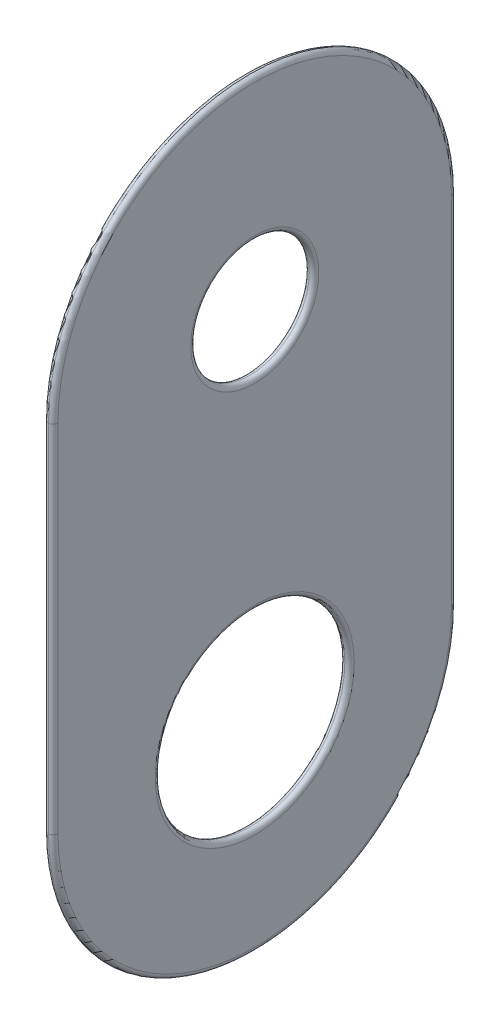
ISO-10303-21;
HEADER;
FILE_DESCRIPTION(('STEP AP214'),'2;1');
FILE_NAME('part.step','',(''),(''),'','','');
FILE_SCHEMA(('AUTOMOTIVE_DESIGN { 1 0 10303 214 1 1 1 1 }'));
ENDSEC;
DATA;
#1=APPLICATION_CONTEXT('core data for automotive mechanical design processes');
#2=APPLICATION_PROTOCOL_DEFINITION('international standard','automotive_design',2000,#1);
#3=PRODUCT_CONTEXT('',#1,'mechanical');
#4=PRODUCT('Part','Part','',(#3));
#5=PRODUCT_RELATED_PRODUCT_CATEGORY('part','',(#4));
#6=PRODUCT_DEFINITION_FORMATION('','',#4);
#7=PRODUCT_DEFINITION_CONTEXT('part definition',#1,'design');
#8=PRODUCT_DEFINITION('design','',#6,#7);
#9=PRODUCT_DEFINITION_SHAPE('','',#8);
#10=(LENGTH_UNIT() NAMED_UNIT(*) SI_UNIT(.MILLI.,.METRE.));
#11=(NAMED_UNIT(*) PLANE_ANGLE_UNIT() SI_UNIT($,.RADIAN.));
#12=(NAMED_UNIT(*) SI_UNIT($,.STERADIAN.) SOLID_ANGLE_UNIT());
#13=UNCERTAINTY_MEASURE_WITH_UNIT(LENGTH_MEASURE(1.E-05),#10,'distance_accuracy_value','');
#14=(GEOMETRIC_REPRESENTATION_CONTEXT(3) GLOBAL_UNCERTAINTY_ASSIGNED_CONTEXT((#13)) GLOBAL_UNIT_ASSIGNED_CONTEXT((#10,
#11,#12)) REPRESENTATION_CONTEXT('',''));
#15=CARTESIAN_POINT('',(0.,0.,0.));
#16=DIRECTION('',(0.,0.,1.));
#17=DIRECTION('',(1.,0.,0.));
#18=AXIS2_PLACEMENT_3D('',#15,#16,#17);
#19=CARTESIAN_POINT('',(0.254,9.525,0.));
#20=DIRECTION('',(1.,0.,0.));
#21=DIRECTION('',(0.,0.,-1.));
#22=AXIS2_PLACEMENT_3D('',#19,#20,#21);
#23=PLANE('',#22);
#24=CARTESIAN_POINT('',(0.254,-9.525,0.));
#25=DIRECTION('',(1.,0.,0.));
#26=DIRECTION('',(0.,0.,-1.));
#27=AXIS2_PLACEMENT_3D('',#24,#25,#26);
#28=CIRCLE('',#27,5.334);
#29=CARTESIAN_POINT('',(0.254,-9.525,-5.334));
#30=VERTEX_POINT('',#29);
#31=EDGE_CURVE('E112',#30,#30,#28,.F.);
#32=ORIENTED_EDGE('',*,*,#31,.T.);
#33=EDGE_LOOP('',(#32));
#34=FACE_BOUND('',#33,.T.);
#35=CARTESIAN_POINT('',(0.254,-9.525,0.));
#36=DIRECTION('',(1.,0.,0.));
#37=DIRECTION('',(0.,0.,-1.));
#38=AXIS2_PLACEMENT_3D('',#35,#36,#37);
#39=CIRCLE('',#38,10.541);
#40=CARTESIAN_POINT('',(0.254,-9.525,10.541));
#41=VERTEX_POINT('',#40);
#42=CARTESIAN_POINT('',(0.254,-9.525,-10.541));
#43=VERTEX_POINT('',#42);
#44=EDGE_CURVE('E110',#41,#43,#39,.T.);
#45=ORIENTED_EDGE('',*,*,#44,.T.);
#46=DIRECTION('',(0.,1.,0.));
#47=VECTOR('',#46,1.);
#48=CARTESIAN_POINT('',(0.254,9.525,-10.541));
#49=LINE('',#48,#47);
#50=CARTESIAN_POINT('',(0.254,9.525,-10.541));
#51=VERTEX_POINT('',#50);
#52=EDGE_CURVE('E91',#43,#51,#49,.T.);
#53=ORIENTED_EDGE('',*,*,#52,.T.);
#54=CARTESIAN_POINT('',(0.254,9.525,0.));
#55=DIRECTION('',(1.,0.,0.));
#56=DIRECTION('',(0.,0.,-1.));
#57=AXIS2_PLACEMENT_3D('',#54,#55,#56);
#58=CIRCLE('',#57,10.541);
#59=CARTESIAN_POINT('',(0.254,9.525,10.541));
#60=VERTEX_POINT('',#59);
#61=EDGE_CURVE('E100',#51,#60,#58,.T.);
#62=ORIENTED_EDGE('',*,*,#61,.T.);
#63=DIRECTION('',(0.,-1.,0.));
#64=VECTOR('',#63,1.);
#65=CARTESIAN_POINT('',(0.254,-9.525,10.541));
#66=LINE('',#65,#64);
#67=EDGE_CURVE('E105',#60,#41,#66,.T.);
#68=ORIENTED_EDGE('',*,*,#67,.T.);
#69=EDGE_LOOP('',(#45,#53,#62,#68));
#70=FACE_BOUND('',#69,.T.);
#71=CARTESIAN_POINT('',(0.254,9.525,0.));
#72=DIRECTION('',(1.,0.,0.));
#73=DIRECTION('',(0.,0.,-1.));
#74=AXIS2_PLACEMENT_3D('',#71,#72,#73);
#75=CIRCLE('',#74,3.429);
#76=CARTESIAN_POINT('',(0.254,9.525,-3.429));
#77=VERTEX_POINT('',#76);
#78=EDGE_CURVE('E106',#77,#77,#75,.F.);
#79=ORIENTED_EDGE('',*,*,#78,.T.);
#80=EDGE_LOOP('',(#79));
#81=FACE_BOUND('',#80,.T.);
#82=ADVANCED_FACE('F32',(#34,#70,#81),#23,.T.);
#83=CARTESIAN_POINT('',(-0.254,9.525,0.));
#84=DIRECTION('',(1.,0.,0.));
#85=DIRECTION('',(0.,0.,-1.));
#86=AXIS2_PLACEMENT_3D('',#83,#84,#85);
#87=PLANE('',#86);
#88=CARTESIAN_POINT('',(-0.254,-9.525,0.));
#89=DIRECTION('',(1.,0.,0.));
#90=DIRECTION('',(0.,0.,-1.));
#91=AXIS2_PLACEMENT_3D('',#88,#89,#90);
#92=CIRCLE('',#91,5.334);
#93=CARTESIAN_POINT('',(-0.254,-9.525,-5.334));
#94=VERTEX_POINT('',#93);
#95=EDGE_CURVE('E11',#94,#94,#92,.T.);
#96=ORIENTED_EDGE('',*,*,#95,.T.);
#97=EDGE_LOOP('',(#96));
#98=FACE_BOUND('',#97,.T.);
#99=CARTESIAN_POINT('',(-0.254,9.525,0.));
#100=DIRECTION('',(1.,0.,0.));
#101=DIRECTION('',(0.,0.,-1.));
#102=AXIS2_PLACEMENT_3D('',#99,#100,#101);
#103=CIRCLE('',#102,3.429);
#104=CARTESIAN_POINT('',(-0.254,9.525,-3.429));
#105=VERTEX_POINT('',#104);
#106=EDGE_CURVE('E41',#105,#105,#103,.T.);
#107=ORIENTED_EDGE('',*,*,#106,.T.);
#108=EDGE_LOOP('',(#107));
#109=FACE_BOUND('',#108,.T.);
#110=CARTESIAN_POINT('',(-0.254,-9.525,0.));
#111=DIRECTION('',(1.,0.,0.));
#112=DIRECTION('',(0.,0.,-1.));
#113=AXIS2_PLACEMENT_3D('',#110,#111,#112);
#114=CIRCLE('',#113,10.541);
#115=CARTESIAN_POINT('',(-0.254,-9.525,-10.541));
#116=VERTEX_POINT('',#115);
#117=CARTESIAN_POINT('',(-0.254,-9.525,10.541));
#118=VERTEX_POINT('',#117);
#119=EDGE_CURVE('E49',#116,#118,#114,.F.);
#120=ORIENTED_EDGE('',*,*,#119,.T.);
#121=DIRECTION('',(0.,-1.,0.));
#122=VECTOR('',#121,1.);
#123=CARTESIAN_POINT('',(-0.254,9.525,10.541));
#124=LINE('',#123,#122);
#125=CARTESIAN_POINT('',(-0.254,9.525,10.541));
#126=VERTEX_POINT('',#125);
#127=EDGE_CURVE('E142',#118,#126,#124,.F.);
#128=ORIENTED_EDGE('',*,*,#127,.T.);
#129=CARTESIAN_POINT('',(-0.254,9.525,0.));
#130=DIRECTION('',(1.,0.,0.));
#131=DIRECTION('',(0.,0.,-1.));
#132=AXIS2_PLACEMENT_3D('',#129,#130,#131);
#133=CIRCLE('',#132,10.541);
#134=CARTESIAN_POINT('',(-0.254,9.525,-10.541));
#135=VERTEX_POINT('',#134);
#136=EDGE_CURVE('E131',#126,#135,#133,.F.);
#137=ORIENTED_EDGE('',*,*,#136,.T.);
#138=DIRECTION('',(0.,1.,0.));
#139=VECTOR('',#138,1.);
#140=CARTESIAN_POINT('',(-0.254,9.525,-10.541));
#141=LINE('',#140,#139);
#142=EDGE_CURVE('E54',#135,#116,#141,.F.);
#143=ORIENTED_EDGE('',*,*,#142,.T.);
#144=EDGE_LOOP('',(#120,#128,#137,#143));
#145=FACE_BOUND('',#144,.T.);
#146=ADVANCED_FACE('F164',(#98,#109,#145),#87,.F.);
#147=CARTESIAN_POINT('',(0.,-9.525,0.));
#148=DIRECTION('',(1.,0.,0.));
#149=DIRECTION('',(0.,0.,-1.));
#150=AXIS2_PLACEMENT_3D('',#147,#148,#149);
#151=TOROIDAL_SURFACE('',#150,5.334,0.254);
#152=ORIENTED_EDGE('',*,*,#31,.F.);
#153=EDGE_LOOP('',(#152));
#154=FACE_BOUND('',#153,.T.);
#155=CARTESIAN_POINT('',(0.,-9.525,0.));
#156=DIRECTION('',(1.,0.,0.));
#157=DIRECTION('',(0.,0.,-1.));
#158=AXIS2_PLACEMENT_3D('',#155,#156,#157);
#159=CIRCLE('',#158,5.08);
#160=CARTESIAN_POINT('',(0.,-9.525,-5.08));
#161=VERTEX_POINT('',#160);
#162=EDGE_CURVE('E138',#161,#161,#159,.T.);
#163=ORIENTED_EDGE('',*,*,#162,.F.);
#164=EDGE_LOOP('',(#163));
#165=FACE_BOUND('',#164,.T.);
#166=ADVANCED_FACE('F166',(#154,#165),#151,.T.);
#167=CARTESIAN_POINT('',(0.,9.525,10.541));
#168=DIRECTION('',(0.,1.,0.));
#169=DIRECTION('',(0.,0.,1.));
#170=AXIS2_PLACEMENT_3D('',#167,#168,#169);
#171=CYLINDRICAL_SURFACE('',#170,0.254);
#172=CARTESIAN_POINT('',(0.,9.525,10.541));
#173=DIRECTION('',(0.,1.,0.));
#174=DIRECTION('',(0.,0.,1.));
#175=AXIS2_PLACEMENT_3D('',#172,#173,#174);
#176=CIRCLE('',#175,0.254);
#177=CARTESIAN_POINT('',(0.,9.525,10.795));
#178=VERTEX_POINT('',#177);
#179=EDGE_CURVE('E102',#178,#60,#176,.T.);
#180=ORIENTED_EDGE('',*,*,#179,.F.);
#181=DIRECTION('',(0.,-1.,0.));
#182=VECTOR('',#181,1.);
#183=CARTESIAN_POINT('',(0.,9.525,10.795));
#184=LINE('',#183,#182);
#185=CARTESIAN_POINT('',(0.,-9.525,10.795));
#186=VERTEX_POINT('',#185);
#187=EDGE_CURVE('E123',#186,#178,#184,.F.);
#188=ORIENTED_EDGE('',*,*,#187,.F.);
#189=CARTESIAN_POINT('',(0.,-9.525,10.541));
#190=DIRECTION('',(0.,-1.,0.));
#191=DIRECTION('',(0.,0.,-1.));
#192=AXIS2_PLACEMENT_3D('',#189,#190,#191);
#193=CIRCLE('',#192,0.254);
#194=EDGE_CURVE('E135',#41,#186,#193,.T.);
#195=ORIENTED_EDGE('',*,*,#194,.F.);
#196=ORIENTED_EDGE('',*,*,#67,.F.);
#197=EDGE_LOOP('',(#180,#188,#195,#196));
#198=FACE_BOUND('',#197,.T.);
#199=ADVANCED_FACE('F173',(#198),#171,.T.);
#200=CARTESIAN_POINT('',(0.,-9.525,0.));
#201=DIRECTION('',(1.,0.,0.));
#202=DIRECTION('',(0.,0.,-1.));
#203=AXIS2_PLACEMENT_3D('',#200,#201,#202);
#204=TOROIDAL_SURFACE('',#203,10.541,0.254);
#205=ORIENTED_EDGE('',*,*,#194,.T.);
#206=CARTESIAN_POINT('',(0.,-9.525,0.));
#207=DIRECTION('',(1.,0.,0.));
#208=DIRECTION('',(0.,0.,-1.));
#209=AXIS2_PLACEMENT_3D('',#206,#207,#208);
#210=CIRCLE('',#209,10.795);
#211=CARTESIAN_POINT('',(0.,-9.525,-10.795));
#212=VERTEX_POINT('',#211);
#213=EDGE_CURVE('E120',#212,#186,#210,.F.);
#214=ORIENTED_EDGE('',*,*,#213,.F.);
#215=CARTESIAN_POINT('',(0.,-9.525,-10.541));
#216=DIRECTION('',(0.,1.,0.));
#217=DIRECTION('',(0.,0.,1.));
#218=AXIS2_PLACEMENT_3D('',#215,#216,#217);
#219=CIRCLE('',#218,0.254);
#220=EDGE_CURVE('E97',#43,#212,#219,.T.);
#221=ORIENTED_EDGE('',*,*,#220,.F.);
#222=ORIENTED_EDGE('',*,*,#44,.F.);
#223=EDGE_LOOP('',(#205,#214,#221,#222));
#224=FACE_BOUND('',#223,.T.);
#225=ADVANCED_FACE('F185',(#224),#204,.T.);
#226=CARTESIAN_POINT('',(0.,9.525,0.));
#227=DIRECTION('',(1.,0.,0.));
#228=DIRECTION('',(0.,0.,-1.));
#229=AXIS2_PLACEMENT_3D('',#226,#227,#228);
#230=TOROIDAL_SURFACE('',#229,10.541,0.254);
#231=ORIENTED_EDGE('',*,*,#179,.T.);
#232=ORIENTED_EDGE('',*,*,#61,.F.);
#233=CARTESIAN_POINT('',(0.,9.525,-10.541));
#234=DIRECTION('',(0.,-1.,0.));
#235=DIRECTION('',(0.,0.,-1.));
#236=AXIS2_PLACEMENT_3D('',#233,#234,#235);
#237=CIRCLE('',#236,0.254);
#238=CARTESIAN_POINT('',(0.,9.525,-10.795));
#239=VERTEX_POINT('',#238);
#240=EDGE_CURVE('E87',#239,#51,#237,.T.);
#241=ORIENTED_EDGE('',*,*,#240,.F.);
#242=CARTESIAN_POINT('',(0.,9.525,0.));
#243=DIRECTION('',(1.,0.,0.));
#244=DIRECTION('',(0.,0.,-1.));
#245=AXIS2_PLACEMENT_3D('',#242,#243,#244);
#246=CIRCLE('',#245,10.795);
#247=EDGE_CURVE('E126',#178,#239,#246,.F.);
#248=ORIENTED_EDGE('',*,*,#247,.F.);
#249=EDGE_LOOP('',(#231,#232,#241,#248));
#250=FACE_BOUND('',#249,.T.);
#251=ADVANCED_FACE('F101',(#250),#230,.T.);
#252=CARTESIAN_POINT('',(0.,9.525,-10.541));
#253=DIRECTION('',(0.,-1.,0.));
#254=DIRECTION('',(0.,0.,-1.));
#255=AXIS2_PLACEMENT_3D('',#252,#253,#254);
#256=CYLINDRICAL_SURFACE('',#255,0.254);
#257=ORIENTED_EDGE('',*,*,#220,.T.);
#258=DIRECTION('',(0.,1.,0.));
#259=VECTOR('',#258,1.);
#260=CARTESIAN_POINT('',(0.,-9.525,-10.795));
#261=LINE('',#260,#259);
#262=EDGE_CURVE('E93',#239,#212,#261,.F.);
#263=ORIENTED_EDGE('',*,*,#262,.F.);
#264=ORIENTED_EDGE('',*,*,#240,.T.);
#265=ORIENTED_EDGE('',*,*,#52,.F.);
#266=EDGE_LOOP('',(#257,#263,#264,#265));
#267=FACE_BOUND('',#266,.T.);
#268=ADVANCED_FACE('F89',(#267),#256,.T.);
#269=CARTESIAN_POINT('',(0.,9.525,0.));
#270=DIRECTION('',(1.,0.,0.));
#271=DIRECTION('',(0.,0.,-1.));
#272=AXIS2_PLACEMENT_3D('',#269,#270,#271);
#273=TOROIDAL_SURFACE('',#272,3.429,0.254);
#274=ORIENTED_EDGE('',*,*,#78,.F.);
#275=EDGE_LOOP('',(#274));
#276=FACE_BOUND('',#275,.T.);
#277=CARTESIAN_POINT('',(0.,9.525,0.));
#278=DIRECTION('',(1.,0.,0.));
#279=DIRECTION('',(0.,0.,-1.));
#280=AXIS2_PLACEMENT_3D('',#277,#278,#279);
#281=CIRCLE('',#280,3.175);
#282=CARTESIAN_POINT('',(0.,9.525,-3.175));
#283=VERTEX_POINT('',#282);
#284=EDGE_CURVE('E129',#283,#283,#281,.T.);
#285=ORIENTED_EDGE('',*,*,#284,.F.);
#286=EDGE_LOOP('',(#285));
#287=FACE_BOUND('',#286,.T.);
#288=ADVANCED_FACE('F182',(#276,#287),#273,.T.);
#289=CARTESIAN_POINT('',(0.,-9.525,0.));
#290=DIRECTION('',(1.,0.,0.));
#291=DIRECTION('',(0.,0.,-1.));
#292=AXIS2_PLACEMENT_3D('',#289,#290,#291);
#293=TOROIDAL_SURFACE('',#292,5.334,0.254);
#294=ORIENTED_EDGE('',*,*,#162,.T.);
#295=EDGE_LOOP('',(#294));
#296=FACE_BOUND('',#295,.T.);
#297=ORIENTED_EDGE('',*,*,#95,.F.);
#298=EDGE_LOOP('',(#297));
#299=FACE_BOUND('',#298,.T.);
#300=ADVANCED_FACE('F194',(#296,#299),#293,.T.);
#301=CARTESIAN_POINT('',(0.,9.525,0.));
#302=DIRECTION('',(1.,0.,0.));
#303=DIRECTION('',(0.,0.,-1.));
#304=AXIS2_PLACEMENT_3D('',#301,#302,#303);
#305=TOROIDAL_SURFACE('',#304,3.429,0.254);
#306=ORIENTED_EDGE('',*,*,#284,.T.);
#307=EDGE_LOOP('',(#306));
#308=FACE_BOUND('',#307,.T.);
#309=ORIENTED_EDGE('',*,*,#106,.F.);
#310=EDGE_LOOP('',(#309));
#311=FACE_BOUND('',#310,.T.);
#312=ADVANCED_FACE('F198',(#308,#311),#305,.T.);
#313=CARTESIAN_POINT('',(0.,9.525,-10.541));
#314=DIRECTION('',(0.,1.,0.));
#315=DIRECTION('',(0.,0.,1.));
#316=AXIS2_PLACEMENT_3D('',#313,#314,#315);
#317=CYLINDRICAL_SURFACE('',#316,0.254);
#318=CARTESIAN_POINT('',(0.,-9.525,-10.541));
#319=DIRECTION('',(0.,-1.,0.));
#320=DIRECTION('',(0.,0.,-1.));
#321=AXIS2_PLACEMENT_3D('',#318,#319,#320);
#322=CIRCLE('',#321,0.254);
#323=EDGE_CURVE('E149',#116,#212,#322,.T.);
#324=ORIENTED_EDGE('',*,*,#323,.F.);
#325=ORIENTED_EDGE('',*,*,#142,.F.);
#326=CARTESIAN_POINT('',(0.,9.525,-10.541));
#327=DIRECTION('',(0.,1.,0.));
#328=DIRECTION('',(0.,0.,1.));
#329=AXIS2_PLACEMENT_3D('',#326,#327,#328);
#330=CIRCLE('',#329,0.254);
#331=EDGE_CURVE('E36',#239,#135,#330,.T.);
#332=ORIENTED_EDGE('',*,*,#331,.F.);
#333=ORIENTED_EDGE('',*,*,#262,.T.);
#334=EDGE_LOOP('',(#324,#325,#332,#333));
#335=FACE_BOUND('',#334,.T.);
#336=ADVANCED_FACE('F34',(#335),#317,.T.);
#337=CARTESIAN_POINT('',(0.,9.525,0.));
#338=DIRECTION('',(1.,0.,0.));
#339=DIRECTION('',(0.,0.,-1.));
#340=AXIS2_PLACEMENT_3D('',#337,#338,#339);
#341=TOROIDAL_SURFACE('',#340,10.541,0.254);
#342=ORIENTED_EDGE('',*,*,#331,.T.);
#343=ORIENTED_EDGE('',*,*,#136,.F.);
#344=CARTESIAN_POINT('',(0.,9.525,10.541));
#345=DIRECTION('',(0.,-1.,0.));
#346=DIRECTION('',(0.,0.,-1.));
#347=AXIS2_PLACEMENT_3D('',#344,#345,#346);
#348=CIRCLE('',#347,0.254);
#349=EDGE_CURVE('E148',#178,#126,#348,.T.);
#350=ORIENTED_EDGE('',*,*,#349,.F.);
#351=ORIENTED_EDGE('',*,*,#247,.T.);
#352=EDGE_LOOP('',(#342,#343,#350,#351));
#353=FACE_BOUND('',#352,.T.);
#354=ADVANCED_FACE('F155',(#353),#341,.T.);
#355=CARTESIAN_POINT('',(0.,-9.525,0.));
#356=DIRECTION('',(1.,0.,0.));
#357=DIRECTION('',(0.,0.,-1.));
#358=AXIS2_PLACEMENT_3D('',#355,#356,#357);
#359=TOROIDAL_SURFACE('',#358,10.541,0.254);
#360=ORIENTED_EDGE('',*,*,#323,.T.);
#361=ORIENTED_EDGE('',*,*,#213,.T.);
#362=CARTESIAN_POINT('',(0.,-9.525,10.541));
#363=DIRECTION('',(0.,1.,0.));
#364=DIRECTION('',(0.,0.,1.));
#365=AXIS2_PLACEMENT_3D('',#362,#363,#364);
#366=CIRCLE('',#365,0.254);
#367=EDGE_CURVE('E146',#118,#186,#366,.T.);
#368=ORIENTED_EDGE('',*,*,#367,.F.);
#369=ORIENTED_EDGE('',*,*,#119,.F.);
#370=EDGE_LOOP('',(#360,#361,#368,#369));
#371=FACE_BOUND('',#370,.T.);
#372=ADVANCED_FACE('F159',(#371),#359,.T.);
#373=CARTESIAN_POINT('',(0.,9.525,10.541));
#374=DIRECTION('',(0.,-1.,0.));
#375=DIRECTION('',(0.,0.,-1.));
#376=AXIS2_PLACEMENT_3D('',#373,#374,#375);
#377=CYLINDRICAL_SURFACE('',#376,0.254);
#378=ORIENTED_EDGE('',*,*,#349,.T.);
#379=ORIENTED_EDGE('',*,*,#127,.F.);
#380=ORIENTED_EDGE('',*,*,#367,.T.);
#381=ORIENTED_EDGE('',*,*,#187,.T.);
#382=EDGE_LOOP('',(#378,#379,#380,#381));
#383=FACE_BOUND('',#382,.T.);
#384=ADVANCED_FACE('F163',(#383),#377,.T.);
#385=CLOSED_SHELL('',(#82,#146,#166,#199,#225,#251,#268,#288,#300,#312,#336,#354,#372,#384));
#386=MANIFOLD_SOLID_BREP('B2',#385);
#387=ADVANCED_BREP_SHAPE_REPRESENTATION('',(#18,#386),#14);
#388=SHAPE_DEFINITION_REPRESENTATION(#9,#387);
ENDSEC;
END-ISO-10303-21;
